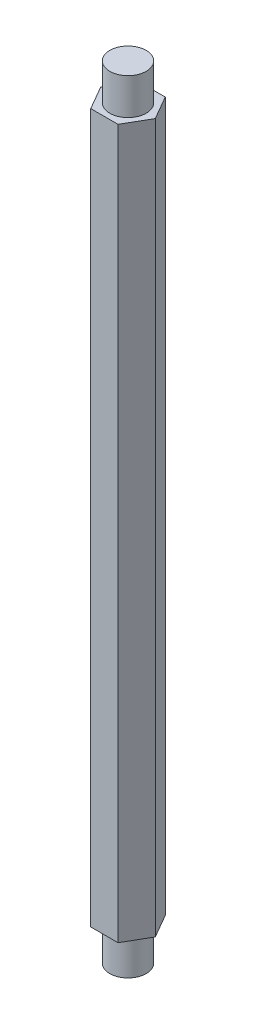
ISO-10303-21;
HEADER;
FILE_DESCRIPTION(('STEP AP214'),'2;1');
FILE_NAME('part.step','',(''),(''),'','','');
FILE_SCHEMA(('AUTOMOTIVE_DESIGN { 1 0 10303 214 1 1 1 1 }'));
ENDSEC;
DATA;
#1=APPLICATION_CONTEXT('core data for automotive mechanical design processes');
#2=APPLICATION_PROTOCOL_DEFINITION('international standard','automotive_design',2000,#1);
#3=PRODUCT_CONTEXT('',#1,'mechanical');
#4=PRODUCT('Part','Part','',(#3));
#5=PRODUCT_RELATED_PRODUCT_CATEGORY('part','',(#4));
#6=PRODUCT_DEFINITION_FORMATION('','',#4);
#7=PRODUCT_DEFINITION_CONTEXT('part definition',#1,'design');
#8=PRODUCT_DEFINITION('design','',#6,#7);
#9=PRODUCT_DEFINITION_SHAPE('','',#8);
#10=(LENGTH_UNIT() NAMED_UNIT(*) SI_UNIT(.MILLI.,.METRE.));
#11=(NAMED_UNIT(*) PLANE_ANGLE_UNIT() SI_UNIT($,.RADIAN.));
#12=(NAMED_UNIT(*) SI_UNIT($,.STERADIAN.) SOLID_ANGLE_UNIT());
#13=UNCERTAINTY_MEASURE_WITH_UNIT(LENGTH_MEASURE(1.E-05),#10,'distance_accuracy_value','');
#14=(GEOMETRIC_REPRESENTATION_CONTEXT(3) GLOBAL_UNCERTAINTY_ASSIGNED_CONTEXT((#13)) GLOBAL_UNIT_ASSIGNED_CONTEXT((#10,
#11,#12)) REPRESENTATION_CONTEXT('',''));
#15=CARTESIAN_POINT('',(0.,0.,0.));
#16=DIRECTION('',(0.,0.,1.));
#17=DIRECTION('',(1.,0.,0.));
#18=AXIS2_PLACEMENT_3D('',#15,#16,#17);
#19=CARTESIAN_POINT('',(0.,2.,0.));
#20=DIRECTION('',(0.,-1.,0.));
#21=DIRECTION('',(0.,0.,-1.));
#22=AXIS2_PLACEMENT_3D('',#19,#20,#21);
#23=CYLINDRICAL_SURFACE('',#22,1.);
#24=CARTESIAN_POINT('',(0.,2.,0.));
#25=DIRECTION('',(0.,1.,0.));
#26=DIRECTION('',(0.,0.,1.));
#27=AXIS2_PLACEMENT_3D('',#24,#25,#26);
#28=CIRCLE('',#27,1.);
#29=CARTESIAN_POINT('',(0.,2.,1.));
#30=VERTEX_POINT('',#29);
#31=EDGE_CURVE('E11',#30,#30,#28,.T.);
#32=ORIENTED_EDGE('',*,*,#31,.F.);
#33=EDGE_LOOP('',(#32));
#34=FACE_BOUND('',#33,.T.);
#35=CARTESIAN_POINT('',(0.,0.,0.));
#36=DIRECTION('',(0.,1.,0.));
#37=DIRECTION('',(0.,0.,1.));
#38=AXIS2_PLACEMENT_3D('',#35,#36,#37);
#39=CIRCLE('',#38,1.);
#40=CARTESIAN_POINT('',(0.,0.,1.));
#41=VERTEX_POINT('',#40);
#42=EDGE_CURVE('E37',#41,#41,#39,.T.);
#43=ORIENTED_EDGE('',*,*,#42,.T.);
#44=EDGE_LOOP('',(#43));
#45=FACE_BOUND('',#44,.T.);
#46=ADVANCED_FACE('F34',(#34,#45),#23,.T.);
#47=CARTESIAN_POINT('',(0.,0.,0.));
#48=DIRECTION('',(0.,1.,0.));
#49=DIRECTION('',(0.,0.,1.));
#50=AXIS2_PLACEMENT_3D('',#47,#48,#49);
#51=PLANE('',#50);
#52=ORIENTED_EDGE('',*,*,#42,.F.);
#53=EDGE_LOOP('',(#52));
#54=FACE_BOUND('',#53,.T.);
#55=ADVANCED_FACE('F143',(#54),#51,.F.);
#56=CARTESIAN_POINT('',(0.750555349946514,41.,1.3));
#57=DIRECTION('',(-0.866025403784438,0.,-0.5));
#58=DIRECTION('',(-0.5,0.,0.866025403784439));
#59=AXIS2_PLACEMENT_3D('',#56,#57,#58);
#60=PLANE('',#59);
#61=DIRECTION('',(0.5,0.,-0.866025403784439));
#62=VECTOR('',#61,1.);
#63=CARTESIAN_POINT('',(0.750555349946514,2.,1.3));
#64=LINE('',#63,#62);
#65=CARTESIAN_POINT('',(0.750555349946514,2.,1.3));
#66=VERTEX_POINT('',#65);
#67=CARTESIAN_POINT('',(1.50111069989303,2.,0.));
#68=VERTEX_POINT('',#67);
#69=EDGE_CURVE('E119',#66,#68,#64,.T.);
#70=ORIENTED_EDGE('',*,*,#69,.T.);
#71=DIRECTION('',(0.,-1.,0.));
#72=VECTOR('',#71,1.);
#73=CARTESIAN_POINT('',(1.50111069989303,41.,0.));
#74=LINE('',#73,#72);
#75=CARTESIAN_POINT('',(1.50111069989303,41.,0.));
#76=VERTEX_POINT('',#75);
#77=EDGE_CURVE('E137',#76,#68,#74,.T.);
#78=ORIENTED_EDGE('',*,*,#77,.F.);
#79=DIRECTION('',(0.5,0.,-0.866025403784439));
#80=VECTOR('',#79,1.);
#81=CARTESIAN_POINT('',(0.750555349946514,41.,1.3));
#82=LINE('',#81,#80);
#83=CARTESIAN_POINT('',(0.750555349946514,41.,1.3));
#84=VERTEX_POINT('',#83);
#85=EDGE_CURVE('E130',#84,#76,#82,.T.);
#86=ORIENTED_EDGE('',*,*,#85,.F.);
#87=DIRECTION('',(0.,-1.,0.));
#88=VECTOR('',#87,1.);
#89=CARTESIAN_POINT('',(0.750555349946514,41.,1.3));
#90=LINE('',#89,#88);
#91=EDGE_CURVE('E115',#84,#66,#90,.T.);
#92=ORIENTED_EDGE('',*,*,#91,.T.);
#93=EDGE_LOOP('',(#70,#78,#86,#92));
#94=FACE_BOUND('',#93,.T.);
#95=ADVANCED_FACE('F145',(#94),#60,.F.);
#96=CARTESIAN_POINT('',(1.50111069989303,41.,0.));
#97=DIRECTION('',(-0.866025403784439,0.,0.5));
#98=DIRECTION('',(0.5,0.,0.866025403784439));
#99=AXIS2_PLACEMENT_3D('',#96,#97,#98);
#100=PLANE('',#99);
#101=DIRECTION('',(-0.5,0.,-0.866025403784439));
#102=VECTOR('',#101,1.);
#103=CARTESIAN_POINT('',(1.50111069989303,2.,0.));
#104=LINE('',#103,#102);
#105=CARTESIAN_POINT('',(0.750555349946513,2.,-1.3));
#106=VERTEX_POINT('',#105);
#107=EDGE_CURVE('E122',#68,#106,#104,.T.);
#108=ORIENTED_EDGE('',*,*,#107,.T.);
#109=DIRECTION('',(0.,-1.,0.));
#110=VECTOR('',#109,1.);
#111=CARTESIAN_POINT('',(0.750555349946513,41.,-1.3));
#112=LINE('',#111,#110);
#113=CARTESIAN_POINT('',(0.750555349946513,41.,-1.3));
#114=VERTEX_POINT('',#113);
#115=EDGE_CURVE('E134',#114,#106,#112,.T.);
#116=ORIENTED_EDGE('',*,*,#115,.F.);
#117=DIRECTION('',(-0.5,0.,-0.866025403784439));
#118=VECTOR('',#117,1.);
#119=CARTESIAN_POINT('',(1.50111069989303,41.,0.));
#120=LINE('',#119,#118);
#121=EDGE_CURVE('E88',#76,#114,#120,.T.);
#122=ORIENTED_EDGE('',*,*,#121,.F.);
#123=ORIENTED_EDGE('',*,*,#77,.T.);
#124=EDGE_LOOP('',(#108,#116,#122,#123));
#125=FACE_BOUND('',#124,.T.);
#126=ADVANCED_FACE('F150',(#125),#100,.F.);
#127=CARTESIAN_POINT('',(0.750555349946513,41.,-1.3));
#128=DIRECTION('',(0.,0.,1.));
#129=DIRECTION('',(1.,0.,0.));
#130=AXIS2_PLACEMENT_3D('',#127,#128,#129);
#131=PLANE('',#130);
#132=DIRECTION('',(-1.,0.,0.));
#133=VECTOR('',#132,1.);
#134=CARTESIAN_POINT('',(0.750555349946513,2.,-1.3));
#135=LINE('',#134,#133);
#136=CARTESIAN_POINT('',(-0.750555349946514,2.,-1.3));
#137=VERTEX_POINT('',#136);
#138=EDGE_CURVE('E125',#106,#137,#135,.T.);
#139=ORIENTED_EDGE('',*,*,#138,.T.);
#140=DIRECTION('',(0.,-1.,0.));
#141=VECTOR('',#140,1.);
#142=CARTESIAN_POINT('',(-0.750555349946514,41.,-1.3));
#143=LINE('',#142,#141);
#144=CARTESIAN_POINT('',(-0.750555349946514,41.,-1.3));
#145=VERTEX_POINT('',#144);
#146=EDGE_CURVE('E110',#145,#137,#143,.T.);
#147=ORIENTED_EDGE('',*,*,#146,.F.);
#148=DIRECTION('',(-1.,0.,0.));
#149=VECTOR('',#148,1.);
#150=CARTESIAN_POINT('',(0.750555349946513,41.,-1.3));
#151=LINE('',#150,#149);
#152=EDGE_CURVE('E101',#114,#145,#151,.T.);
#153=ORIENTED_EDGE('',*,*,#152,.F.);
#154=ORIENTED_EDGE('',*,*,#115,.T.);
#155=EDGE_LOOP('',(#139,#147,#153,#154));
#156=FACE_BOUND('',#155,.T.);
#157=ADVANCED_FACE('F157',(#156),#131,.F.);
#158=CARTESIAN_POINT('',(-0.750555349946514,41.,-1.3));
#159=DIRECTION('',(0.866025403784439,0.,0.5));
#160=DIRECTION('',(0.5,0.,-0.866025403784439));
#161=AXIS2_PLACEMENT_3D('',#158,#159,#160);
#162=PLANE('',#161);
#163=DIRECTION('',(-0.5,0.,0.866025403784439));
#164=VECTOR('',#163,1.);
#165=CARTESIAN_POINT('',(-0.750555349946514,2.,-1.3));
#166=LINE('',#165,#164);
#167=CARTESIAN_POINT('',(-1.50111069989303,2.,0.));
#168=VERTEX_POINT('',#167);
#169=EDGE_CURVE('E109',#137,#168,#166,.T.);
#170=ORIENTED_EDGE('',*,*,#169,.T.);
#171=DIRECTION('',(0.,-1.,0.));
#172=VECTOR('',#171,1.);
#173=CARTESIAN_POINT('',(-1.50111069989303,41.,0.));
#174=LINE('',#173,#172);
#175=CARTESIAN_POINT('',(-1.50111069989303,41.,0.));
#176=VERTEX_POINT('',#175);
#177=EDGE_CURVE('E106',#176,#168,#174,.T.);
#178=ORIENTED_EDGE('',*,*,#177,.F.);
#179=DIRECTION('',(-0.5,0.,0.866025403784439));
#180=VECTOR('',#179,1.);
#181=CARTESIAN_POINT('',(-0.750555349946514,41.,-1.3));
#182=LINE('',#181,#180);
#183=EDGE_CURVE('E95',#145,#176,#182,.T.);
#184=ORIENTED_EDGE('',*,*,#183,.F.);
#185=ORIENTED_EDGE('',*,*,#146,.T.);
#186=EDGE_LOOP('',(#170,#178,#184,#185));
#187=FACE_BOUND('',#186,.T.);
#188=ADVANCED_FACE('F107',(#187),#162,.F.);
#189=CARTESIAN_POINT('',(-1.50111069989303,41.,0.));
#190=DIRECTION('',(0.866025403784439,0.,-0.5));
#191=DIRECTION('',(-0.5,0.,-0.866025403784439));
#192=AXIS2_PLACEMENT_3D('',#189,#190,#191);
#193=PLANE('',#192);
#194=DIRECTION('',(0.5,0.,0.866025403784438));
#195=VECTOR('',#194,1.);
#196=CARTESIAN_POINT('',(-1.50111069989303,2.,0.));
#197=LINE('',#196,#195);
#198=CARTESIAN_POINT('',(-0.750555349946513,2.,1.3));
#199=VERTEX_POINT('',#198);
#200=EDGE_CURVE('E73',#168,#199,#197,.T.);
#201=ORIENTED_EDGE('',*,*,#200,.T.);
#202=DIRECTION('',(0.,-1.,0.));
#203=VECTOR('',#202,1.);
#204=CARTESIAN_POINT('',(-0.750555349946513,41.,1.3));
#205=LINE('',#204,#203);
#206=CARTESIAN_POINT('',(-0.750555349946513,41.,1.3));
#207=VERTEX_POINT('',#206);
#208=EDGE_CURVE('E111',#207,#199,#205,.T.);
#209=ORIENTED_EDGE('',*,*,#208,.F.);
#210=DIRECTION('',(0.5,0.,0.866025403784438));
#211=VECTOR('',#210,1.);
#212=CARTESIAN_POINT('',(-1.50111069989303,41.,0.));
#213=LINE('',#212,#211);
#214=EDGE_CURVE('E99',#176,#207,#213,.T.);
#215=ORIENTED_EDGE('',*,*,#214,.F.);
#216=ORIENTED_EDGE('',*,*,#177,.T.);
#217=EDGE_LOOP('',(#201,#209,#215,#216));
#218=FACE_BOUND('',#217,.T.);
#219=ADVANCED_FACE('F113',(#218),#193,.F.);
#220=CARTESIAN_POINT('',(-0.750555349946513,41.,1.3));
#221=DIRECTION('',(0.,0.,-1.));
#222=DIRECTION('',(-1.,0.,0.));
#223=AXIS2_PLACEMENT_3D('',#220,#221,#222);
#224=PLANE('',#223);
#225=DIRECTION('',(1.,0.,0.));
#226=VECTOR('',#225,1.);
#227=CARTESIAN_POINT('',(-0.750555349946513,2.,1.3));
#228=LINE('',#227,#226);
#229=EDGE_CURVE('E79',#199,#66,#228,.T.);
#230=ORIENTED_EDGE('',*,*,#229,.T.);
#231=ORIENTED_EDGE('',*,*,#91,.F.);
#232=DIRECTION('',(1.,0.,0.));
#233=VECTOR('',#232,1.);
#234=CARTESIAN_POINT('',(-0.750555349946513,41.,1.3));
#235=LINE('',#234,#233);
#236=EDGE_CURVE('E50',#207,#84,#235,.T.);
#237=ORIENTED_EDGE('',*,*,#236,.F.);
#238=ORIENTED_EDGE('',*,*,#208,.T.);
#239=EDGE_LOOP('',(#230,#231,#237,#238));
#240=FACE_BOUND('',#239,.T.);
#241=ADVANCED_FACE('F165',(#240),#224,.F.);
#242=CARTESIAN_POINT('',(0.,41.,0.));
#243=DIRECTION('',(0.,1.,0.));
#244=DIRECTION('',(0.,0.,1.));
#245=AXIS2_PLACEMENT_3D('',#242,#243,#244);
#246=PLANE('',#245);
#247=CARTESIAN_POINT('',(0.,41.,0.));
#248=DIRECTION('',(0.,1.,0.));
#249=DIRECTION('',(0.,0.,1.));
#250=AXIS2_PLACEMENT_3D('',#247,#248,#249);
#251=CIRCLE('',#250,1.);
#252=CARTESIAN_POINT('',(0.,41.,1.));
#253=VERTEX_POINT('',#252);
#254=EDGE_CURVE('E186',#253,#253,#251,.T.);
#255=ORIENTED_EDGE('',*,*,#254,.F.);
#256=EDGE_LOOP('',(#255));
#257=FACE_BOUND('',#256,.T.);
#258=ORIENTED_EDGE('',*,*,#85,.T.);
#259=ORIENTED_EDGE('',*,*,#121,.T.);
#260=ORIENTED_EDGE('',*,*,#152,.T.);
#261=ORIENTED_EDGE('',*,*,#183,.T.);
#262=ORIENTED_EDGE('',*,*,#214,.T.);
#263=ORIENTED_EDGE('',*,*,#236,.T.);
#264=EDGE_LOOP('',(#258,#259,#260,#261,#262,#263));
#265=FACE_BOUND('',#264,.T.);
#266=ADVANCED_FACE('F97',(#257,#265),#246,.T.);
#267=CARTESIAN_POINT('',(0.,2.,0.));
#268=DIRECTION('',(0.,1.,0.));
#269=DIRECTION('',(0.,0.,1.));
#270=AXIS2_PLACEMENT_3D('',#267,#268,#269);
#271=PLANE('',#270);
#272=ORIENTED_EDGE('',*,*,#31,.T.);
#273=EDGE_LOOP('',(#272));
#274=FACE_BOUND('',#273,.T.);
#275=ORIENTED_EDGE('',*,*,#69,.F.);
#276=ORIENTED_EDGE('',*,*,#229,.F.);
#277=ORIENTED_EDGE('',*,*,#200,.F.);
#278=ORIENTED_EDGE('',*,*,#169,.F.);
#279=ORIENTED_EDGE('',*,*,#138,.F.);
#280=ORIENTED_EDGE('',*,*,#107,.F.);
#281=EDGE_LOOP('',(#275,#276,#277,#278,#279,#280));
#282=FACE_BOUND('',#281,.T.);
#283=ADVANCED_FACE('F168',(#274,#282),#271,.F.);
#284=CARTESIAN_POINT('',(0.,43.,0.));
#285=DIRECTION('',(0.,-1.,0.));
#286=DIRECTION('',(0.,0.,-1.));
#287=AXIS2_PLACEMENT_3D('',#284,#285,#286);
#288=CYLINDRICAL_SURFACE('',#287,1.);
#289=CARTESIAN_POINT('',(0.,43.,0.));
#290=DIRECTION('',(0.,1.,0.));
#291=DIRECTION('',(0.,0.,1.));
#292=AXIS2_PLACEMENT_3D('',#289,#290,#291);
#293=CIRCLE('',#292,1.);
#294=CARTESIAN_POINT('',(0.,43.,1.));
#295=VERTEX_POINT('',#294);
#296=EDGE_CURVE('E123',#295,#295,#293,.T.);
#297=ORIENTED_EDGE('',*,*,#296,.F.);
#298=EDGE_LOOP('',(#297));
#299=FACE_BOUND('',#298,.T.);
#300=ORIENTED_EDGE('',*,*,#254,.T.);
#301=EDGE_LOOP('',(#300));
#302=FACE_BOUND('',#301,.T.);
#303=ADVANCED_FACE('F171',(#299,#302),#288,.T.);
#304=CARTESIAN_POINT('',(0.,43.,0.));
#305=DIRECTION('',(0.,1.,0.));
#306=DIRECTION('',(0.,0.,1.));
#307=AXIS2_PLACEMENT_3D('',#304,#305,#306);
#308=PLANE('',#307);
#309=ORIENTED_EDGE('',*,*,#296,.T.);
#310=EDGE_LOOP('',(#309));
#311=FACE_BOUND('',#310,.T.);
#312=ADVANCED_FACE('F178',(#311),#308,.T.);
#313=CLOSED_SHELL('',(#46,#55,#95,#126,#157,#188,#219,#241,#266,#283,#303,#312));
#314=MANIFOLD_SOLID_BREP('B2',#313);
#315=ADVANCED_BREP_SHAPE_REPRESENTATION('',(#18,#314),#14);
#316=SHAPE_DEFINITION_REPRESENTATION(#9,#315);
ENDSEC;
END-ISO-10303-21;
